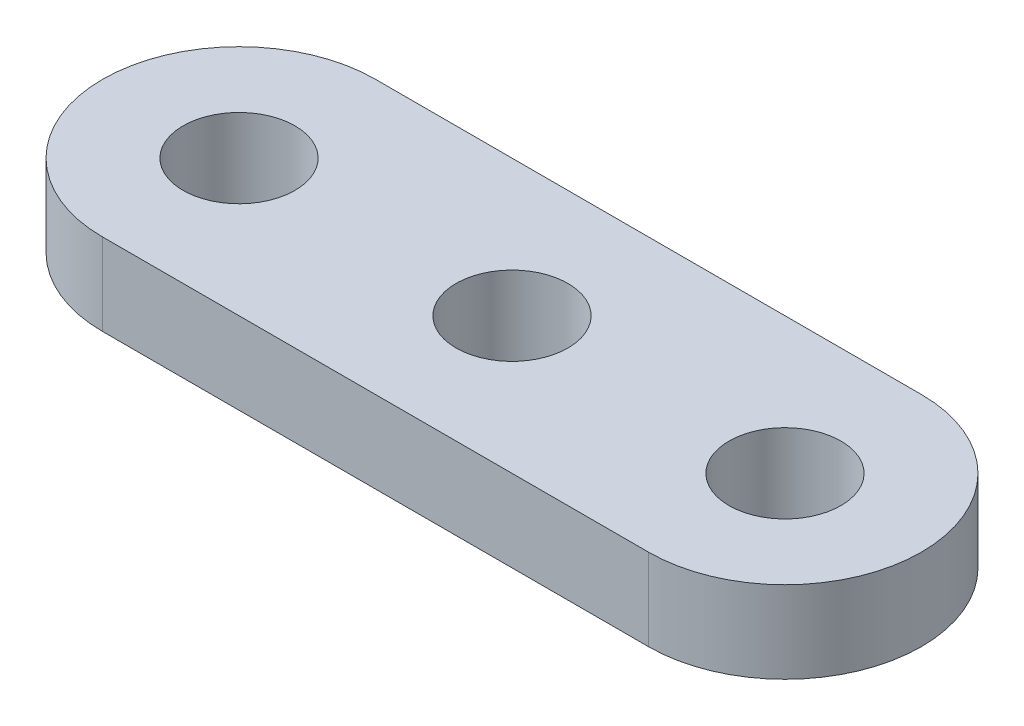
ISO-10303-21;
HEADER;
FILE_DESCRIPTION(('STEP AP214'),'2;1');
FILE_NAME('part.step','',(''),(''),'','','');
FILE_SCHEMA(('AUTOMOTIVE_DESIGN { 1 0 10303 214 1 1 1 1 }'));
ENDSEC;
DATA;
#1=APPLICATION_CONTEXT('core data for automotive mechanical design processes');
#2=APPLICATION_PROTOCOL_DEFINITION('international standard','automotive_design',2000,#1);
#3=PRODUCT_CONTEXT('',#1,'mechanical');
#4=PRODUCT('Part','Part','',(#3));
#5=PRODUCT_RELATED_PRODUCT_CATEGORY('part','',(#4));
#6=PRODUCT_DEFINITION_FORMATION('','',#4);
#7=PRODUCT_DEFINITION_CONTEXT('part definition',#1,'design');
#8=PRODUCT_DEFINITION('design','',#6,#7);
#9=PRODUCT_DEFINITION_SHAPE('','',#8);
#10=(LENGTH_UNIT() NAMED_UNIT(*) SI_UNIT(.MILLI.,.METRE.));
#11=(NAMED_UNIT(*) PLANE_ANGLE_UNIT() SI_UNIT($,.RADIAN.));
#12=(NAMED_UNIT(*) SI_UNIT($,.STERADIAN.) SOLID_ANGLE_UNIT());
#13=UNCERTAINTY_MEASURE_WITH_UNIT(LENGTH_MEASURE(1.E-05),#10,'distance_accuracy_value','');
#14=(GEOMETRIC_REPRESENTATION_CONTEXT(3) GLOBAL_UNCERTAINTY_ASSIGNED_CONTEXT((#13)) GLOBAL_UNIT_ASSIGNED_CONTEXT((#10,
#11,#12)) REPRESENTATION_CONTEXT('',''));
#15=CARTESIAN_POINT('',(0.,0.,0.));
#16=DIRECTION('',(0.,0.,1.));
#17=DIRECTION('',(1.,0.,0.));
#18=AXIS2_PLACEMENT_3D('',#15,#16,#17);
#19=CARTESIAN_POINT('',(-10.,1.5,5.));
#20=DIRECTION('',(0.,1.,0.));
#21=DIRECTION('',(0.,0.,1.));
#22=AXIS2_PLACEMENT_3D('',#19,#20,#21);
#23=PLANE('',#22);
#24=CARTESIAN_POINT('',(-10.,1.5,5.));
#25=DIRECTION('',(0.,1.,0.));
#26=DIRECTION('',(0.,0.,-1.));
#27=AXIS2_PLACEMENT_3D('',#24,#25,#26);
#28=CIRCLE('',#27,2.05);
#29=CARTESIAN_POINT('',(-10.,1.5,2.95));
#30=VERTEX_POINT('',#29);
#31=EDGE_CURVE('E136',#30,#30,#28,.T.);
#32=ORIENTED_EDGE('',*,*,#31,.F.);
#33=EDGE_LOOP('',(#32));
#34=FACE_BOUND('',#33,.T.);
#35=CARTESIAN_POINT('',(-10.,1.5,5.));
#36=DIRECTION('',(0.,1.,0.));
#37=DIRECTION('',(0.,0.,1.));
#38=AXIS2_PLACEMENT_3D('',#35,#36,#37);
#39=CIRCLE('',#38,5.);
#40=CARTESIAN_POINT('',(-10.,1.5,0.));
#41=VERTEX_POINT('',#40);
#42=CARTESIAN_POINT('',(-10.,1.5,10.));
#43=VERTEX_POINT('',#42);
#44=EDGE_CURVE('E95',#41,#43,#39,.T.);
#45=ORIENTED_EDGE('',*,*,#44,.T.);
#46=DIRECTION('',(1.,0.,0.));
#47=VECTOR('',#46,1.);
#48=CARTESIAN_POINT('',(-10.,1.5,10.));
#49=LINE('',#48,#47);
#50=CARTESIAN_POINT('',(10.,1.5,10.));
#51=VERTEX_POINT('',#50);
#52=EDGE_CURVE('E89',#43,#51,#49,.T.);
#53=ORIENTED_EDGE('',*,*,#52,.T.);
#54=CARTESIAN_POINT('',(10.,1.5,5.));
#55=DIRECTION('',(0.,1.,0.));
#56=DIRECTION('',(0.,0.,1.));
#57=AXIS2_PLACEMENT_3D('',#54,#55,#56);
#58=CIRCLE('',#57,5.);
#59=CARTESIAN_POINT('',(10.,1.5,0.));
#60=VERTEX_POINT('',#59);
#61=EDGE_CURVE('E92',#51,#60,#58,.T.);
#62=ORIENTED_EDGE('',*,*,#61,.T.);
#63=DIRECTION('',(-1.,0.,0.));
#64=VECTOR('',#63,1.);
#65=CARTESIAN_POINT('',(5.,1.5,0.));
#66=LINE('',#65,#64);
#67=EDGE_CURVE('E61',#60,#41,#66,.T.);
#68=ORIENTED_EDGE('',*,*,#67,.T.);
#69=EDGE_LOOP('',(#45,#53,#62,#68));
#70=FACE_BOUND('',#69,.T.);
#71=CARTESIAN_POINT('',(10.,1.5,5.));
#72=DIRECTION('',(0.,1.,0.));
#73=DIRECTION('',(0.,0.,1.));
#74=AXIS2_PLACEMENT_3D('',#71,#72,#73);
#75=CIRCLE('',#74,2.05);
#76=CARTESIAN_POINT('',(10.,1.5,7.05));
#77=VERTEX_POINT('',#76);
#78=EDGE_CURVE('E117',#77,#77,#75,.T.);
#79=ORIENTED_EDGE('',*,*,#78,.F.);
#80=EDGE_LOOP('',(#79));
#81=FACE_BOUND('',#80,.T.);
#82=CARTESIAN_POINT('',(0.,1.5,5.));
#83=DIRECTION('',(0.,1.,0.));
#84=DIRECTION('',(0.,0.,1.));
#85=AXIS2_PLACEMENT_3D('',#82,#83,#84);
#86=CIRCLE('',#85,2.05);
#87=CARTESIAN_POINT('',(0.,1.5,7.05));
#88=VERTEX_POINT('',#87);
#89=EDGE_CURVE('E144',#88,#88,#86,.T.);
#90=ORIENTED_EDGE('',*,*,#89,.F.);
#91=EDGE_LOOP('',(#90));
#92=FACE_BOUND('',#91,.T.);
#93=ADVANCED_FACE('F43',(#34,#70,#81,#92),#23,.T.);
#94=CARTESIAN_POINT('',(-10.,-1.5,5.));
#95=DIRECTION('',(0.,1.,0.));
#96=DIRECTION('',(0.,0.,1.));
#97=AXIS2_PLACEMENT_3D('',#94,#95,#96);
#98=PLANE('',#97);
#99=CARTESIAN_POINT('',(-10.,-1.5,5.));
#100=DIRECTION('',(0.,1.,0.));
#101=DIRECTION('',(0.,0.,1.));
#102=AXIS2_PLACEMENT_3D('',#99,#100,#101);
#103=CIRCLE('',#102,5.);
#104=CARTESIAN_POINT('',(-10.,-1.5,0.));
#105=VERTEX_POINT('',#104);
#106=CARTESIAN_POINT('',(-10.,-1.5,10.));
#107=VERTEX_POINT('',#106);
#108=EDGE_CURVE('E113',#105,#107,#103,.T.);
#109=ORIENTED_EDGE('',*,*,#108,.F.);
#110=DIRECTION('',(-1.,0.,0.));
#111=VECTOR('',#110,1.);
#112=CARTESIAN_POINT('',(-10.,-1.5,0.));
#113=LINE('',#112,#111);
#114=CARTESIAN_POINT('',(10.,-1.5,0.));
#115=VERTEX_POINT('',#114);
#116=EDGE_CURVE('E78',#115,#105,#113,.T.);
#117=ORIENTED_EDGE('',*,*,#116,.F.);
#118=CARTESIAN_POINT('',(10.,-1.5,5.));
#119=DIRECTION('',(0.,1.,0.));
#120=DIRECTION('',(0.,0.,1.));
#121=AXIS2_PLACEMENT_3D('',#118,#119,#120);
#122=CIRCLE('',#121,5.);
#123=CARTESIAN_POINT('',(10.,-1.5,10.));
#124=VERTEX_POINT('',#123);
#125=EDGE_CURVE('E120',#124,#115,#122,.T.);
#126=ORIENTED_EDGE('',*,*,#125,.F.);
#127=DIRECTION('',(1.,0.,0.));
#128=VECTOR('',#127,1.);
#129=CARTESIAN_POINT('',(5.,-1.5,10.));
#130=LINE('',#129,#128);
#131=EDGE_CURVE('E101',#107,#124,#130,.T.);
#132=ORIENTED_EDGE('',*,*,#131,.F.);
#133=EDGE_LOOP('',(#109,#117,#126,#132));
#134=FACE_BOUND('',#133,.T.);
#135=CARTESIAN_POINT('',(10.,-1.5,5.));
#136=DIRECTION('',(0.,1.,0.));
#137=DIRECTION('',(0.,0.,1.));
#138=AXIS2_PLACEMENT_3D('',#135,#136,#137);
#139=CIRCLE('',#138,2.05);
#140=CARTESIAN_POINT('',(10.,-1.5,7.05));
#141=VERTEX_POINT('',#140);
#142=EDGE_CURVE('E132',#141,#141,#139,.T.);
#143=ORIENTED_EDGE('',*,*,#142,.T.);
#144=EDGE_LOOP('',(#143));
#145=FACE_BOUND('',#144,.T.);
#146=CARTESIAN_POINT('',(-10.,-1.5,5.));
#147=DIRECTION('',(0.,1.,0.));
#148=DIRECTION('',(0.,0.,-1.));
#149=AXIS2_PLACEMENT_3D('',#146,#147,#148);
#150=CIRCLE('',#149,2.05);
#151=CARTESIAN_POINT('',(-10.,-1.5,2.95));
#152=VERTEX_POINT('',#151);
#153=EDGE_CURVE('E140',#152,#152,#150,.T.);
#154=ORIENTED_EDGE('',*,*,#153,.T.);
#155=EDGE_LOOP('',(#154));
#156=FACE_BOUND('',#155,.T.);
#157=CARTESIAN_POINT('',(0.,-1.5,5.));
#158=DIRECTION('',(0.,1.,0.));
#159=DIRECTION('',(0.,0.,1.));
#160=AXIS2_PLACEMENT_3D('',#157,#158,#159);
#161=CIRCLE('',#160,2.05);
#162=CARTESIAN_POINT('',(0.,-1.5,7.05));
#163=VERTEX_POINT('',#162);
#164=EDGE_CURVE('E148',#163,#163,#161,.T.);
#165=ORIENTED_EDGE('',*,*,#164,.T.);
#166=EDGE_LOOP('',(#165));
#167=FACE_BOUND('',#166,.T.);
#168=ADVANCED_FACE('F160',(#134,#145,#156,#167),#98,.F.);
#169=CARTESIAN_POINT('',(-10.,1.5,5.));
#170=DIRECTION('',(0.,-1.,0.));
#171=DIRECTION('',(0.,0.,-1.));
#172=AXIS2_PLACEMENT_3D('',#169,#170,#171);
#173=CYLINDRICAL_SURFACE('',#172,5.);
#174=ORIENTED_EDGE('',*,*,#108,.T.);
#175=DIRECTION('',(0.,-1.,0.));
#176=VECTOR('',#175,1.);
#177=CARTESIAN_POINT('',(-10.,1.5,10.));
#178=LINE('',#177,#176);
#179=EDGE_CURVE('E11',#43,#107,#178,.T.);
#180=ORIENTED_EDGE('',*,*,#179,.F.);
#181=ORIENTED_EDGE('',*,*,#44,.F.);
#182=DIRECTION('',(0.,-1.,0.));
#183=VECTOR('',#182,1.);
#184=CARTESIAN_POINT('',(-10.,1.5,0.));
#185=LINE('',#184,#183);
#186=EDGE_CURVE('E109',#41,#105,#185,.T.);
#187=ORIENTED_EDGE('',*,*,#186,.T.);
#188=EDGE_LOOP('',(#174,#180,#181,#187));
#189=FACE_BOUND('',#188,.T.);
#190=ADVANCED_FACE('F45',(#189),#173,.T.);
#191=CARTESIAN_POINT('',(5.,1.5,10.));
#192=DIRECTION('',(0.,0.,-1.));
#193=DIRECTION('',(-1.,0.,0.));
#194=AXIS2_PLACEMENT_3D('',#191,#192,#193);
#195=PLANE('',#194);
#196=ORIENTED_EDGE('',*,*,#131,.T.);
#197=DIRECTION('',(0.,-1.,0.));
#198=VECTOR('',#197,1.);
#199=CARTESIAN_POINT('',(10.,1.5,10.));
#200=LINE('',#199,#198);
#201=EDGE_CURVE('E53',#51,#124,#200,.T.);
#202=ORIENTED_EDGE('',*,*,#201,.F.);
#203=ORIENTED_EDGE('',*,*,#52,.F.);
#204=ORIENTED_EDGE('',*,*,#179,.T.);
#205=EDGE_LOOP('',(#196,#202,#203,#204));
#206=FACE_BOUND('',#205,.T.);
#207=ADVANCED_FACE('F100',(#206),#195,.F.);
#208=CARTESIAN_POINT('',(10.,1.5,5.));
#209=DIRECTION('',(0.,-1.,0.));
#210=DIRECTION('',(0.,0.,-1.));
#211=AXIS2_PLACEMENT_3D('',#208,#209,#210);
#212=CYLINDRICAL_SURFACE('',#211,5.);
#213=ORIENTED_EDGE('',*,*,#125,.T.);
#214=DIRECTION('',(0.,-1.,0.));
#215=VECTOR('',#214,1.);
#216=CARTESIAN_POINT('',(10.,1.5,0.));
#217=LINE('',#216,#215);
#218=EDGE_CURVE('E104',#60,#115,#217,.T.);
#219=ORIENTED_EDGE('',*,*,#218,.F.);
#220=ORIENTED_EDGE('',*,*,#61,.F.);
#221=ORIENTED_EDGE('',*,*,#201,.T.);
#222=EDGE_LOOP('',(#213,#219,#220,#221));
#223=FACE_BOUND('',#222,.T.);
#224=ADVANCED_FACE('F105',(#223),#212,.T.);
#225=CARTESIAN_POINT('',(-10.,1.5,0.));
#226=DIRECTION('',(0.,0.,1.));
#227=DIRECTION('',(1.,0.,0.));
#228=AXIS2_PLACEMENT_3D('',#225,#226,#227);
#229=PLANE('',#228);
#230=ORIENTED_EDGE('',*,*,#116,.T.);
#231=ORIENTED_EDGE('',*,*,#186,.F.);
#232=ORIENTED_EDGE('',*,*,#67,.F.);
#233=ORIENTED_EDGE('',*,*,#218,.T.);
#234=EDGE_LOOP('',(#230,#231,#232,#233));
#235=FACE_BOUND('',#234,.T.);
#236=ADVANCED_FACE('F128',(#235),#229,.F.);
#237=CARTESIAN_POINT('',(10.,1.5,5.));
#238=DIRECTION('',(0.,-1.,0.));
#239=DIRECTION('',(0.,0.,-1.));
#240=AXIS2_PLACEMENT_3D('',#237,#238,#239);
#241=CYLINDRICAL_SURFACE('',#240,2.05);
#242=ORIENTED_EDGE('',*,*,#78,.T.);
#243=EDGE_LOOP('',(#242));
#244=FACE_BOUND('',#243,.T.);
#245=ORIENTED_EDGE('',*,*,#142,.F.);
#246=EDGE_LOOP('',(#245));
#247=FACE_BOUND('',#246,.T.);
#248=ADVANCED_FACE('F169',(#244,#247),#241,.F.);
#249=CARTESIAN_POINT('',(-10.,1.5,5.));
#250=DIRECTION('',(0.,-1.,0.));
#251=DIRECTION('',(0.,0.,-1.));
#252=AXIS2_PLACEMENT_3D('',#249,#250,#251);
#253=CYLINDRICAL_SURFACE('',#252,2.05);
#254=ORIENTED_EDGE('',*,*,#31,.T.);
#255=EDGE_LOOP('',(#254));
#256=FACE_BOUND('',#255,.T.);
#257=ORIENTED_EDGE('',*,*,#153,.F.);
#258=EDGE_LOOP('',(#257));
#259=FACE_BOUND('',#258,.T.);
#260=ADVANCED_FACE('F225',(#256,#259),#253,.F.);
#261=CARTESIAN_POINT('',(0.,1.5,5.));
#262=DIRECTION('',(0.,-1.,0.));
#263=DIRECTION('',(0.,0.,-1.));
#264=AXIS2_PLACEMENT_3D('',#261,#262,#263);
#265=CYLINDRICAL_SURFACE('',#264,2.05);
#266=ORIENTED_EDGE('',*,*,#89,.T.);
#267=EDGE_LOOP('',(#266));
#268=FACE_BOUND('',#267,.T.);
#269=ORIENTED_EDGE('',*,*,#164,.F.);
#270=EDGE_LOOP('',(#269));
#271=FACE_BOUND('',#270,.T.);
#272=ADVANCED_FACE('F156',(#268,#271),#265,.F.);
#273=CLOSED_SHELL('',(#93,#168,#190,#207,#224,#236,#248,#260,#272));
#274=MANIFOLD_SOLID_BREP('B2',#273);
#275=ADVANCED_BREP_SHAPE_REPRESENTATION('',(#18,#274),#14);
#276=SHAPE_DEFINITION_REPRESENTATION(#9,#275);
ENDSEC;
END-ISO-10303-21;
